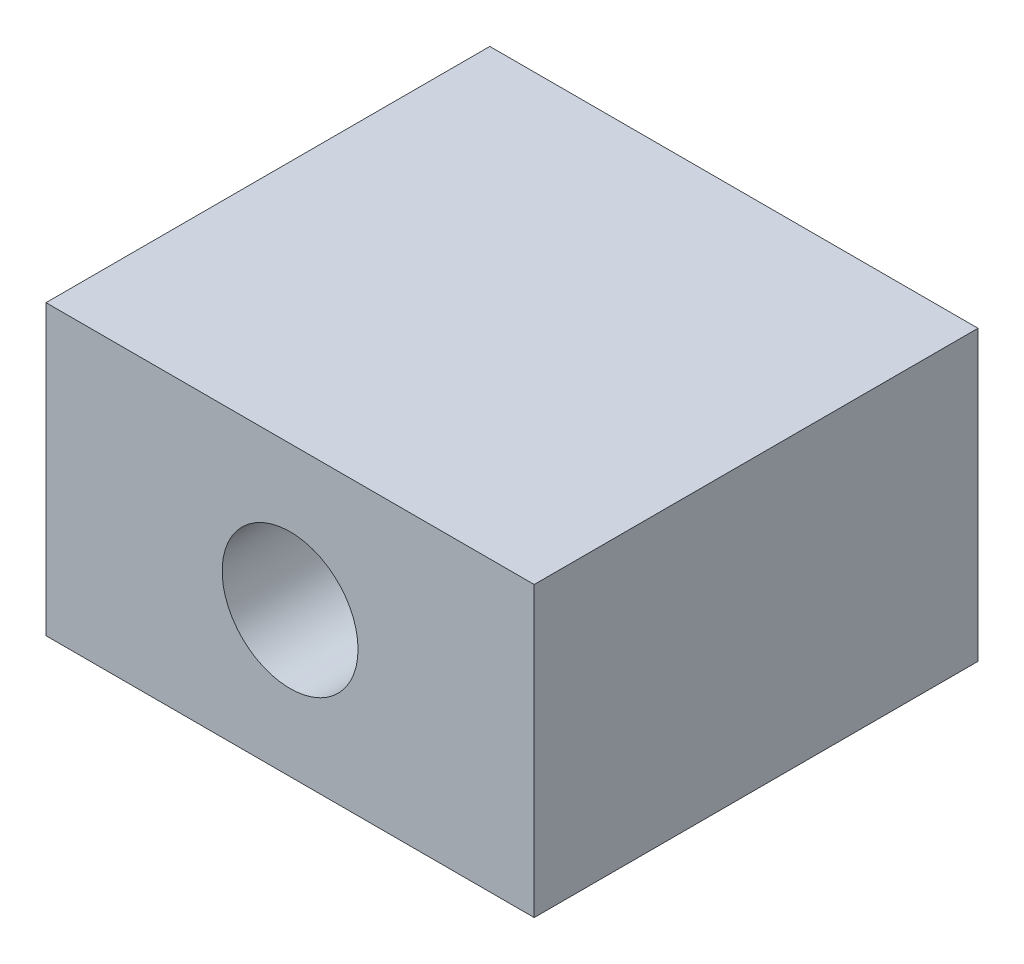
ISO-10303-21;
HEADER;
FILE_DESCRIPTION(('STEP AP214'),'2;1');
FILE_NAME('part.step','',(''),(''),'','','');
FILE_SCHEMA(('AUTOMOTIVE_DESIGN { 1 0 10303 214 1 1 1 1 }'));
ENDSEC;
DATA;
#1=APPLICATION_CONTEXT('core data for automotive mechanical design processes');
#2=APPLICATION_PROTOCOL_DEFINITION('international standard','automotive_design',2000,#1);
#3=PRODUCT_CONTEXT('',#1,'mechanical');
#4=PRODUCT('Part','Part','',(#3));
#5=PRODUCT_RELATED_PRODUCT_CATEGORY('part','',(#4));
#6=PRODUCT_DEFINITION_FORMATION('','',#4);
#7=PRODUCT_DEFINITION_CONTEXT('part definition',#1,'design');
#8=PRODUCT_DEFINITION('design','',#6,#7);
#9=PRODUCT_DEFINITION_SHAPE('','',#8);
#10=(LENGTH_UNIT() NAMED_UNIT(*) SI_UNIT(.MILLI.,.METRE.));
#11=(NAMED_UNIT(*) PLANE_ANGLE_UNIT() SI_UNIT($,.RADIAN.));
#12=(NAMED_UNIT(*) SI_UNIT($,.STERADIAN.) SOLID_ANGLE_UNIT());
#13=UNCERTAINTY_MEASURE_WITH_UNIT(LENGTH_MEASURE(1.E-05),#10,'distance_accuracy_value','');
#14=(GEOMETRIC_REPRESENTATION_CONTEXT(3) GLOBAL_UNCERTAINTY_ASSIGNED_CONTEXT((#13)) GLOBAL_UNIT_ASSIGNED_CONTEXT((#10,
#11,#12)) REPRESENTATION_CONTEXT('',''));
#15=CARTESIAN_POINT('',(0.,0.,0.));
#16=DIRECTION('',(0.,0.,1.));
#17=DIRECTION('',(1.,0.,0.));
#18=AXIS2_PLACEMENT_3D('',#15,#16,#17);
#19=CARTESIAN_POINT('',(139.7,-82.55,254.));
#20=DIRECTION('',(-1.,0.,0.));
#21=DIRECTION('',(0.,0.,1.));
#22=AXIS2_PLACEMENT_3D('',#19,#20,#21);
#23=PLANE('',#22);
#24=DIRECTION('',(0.,1.,0.));
#25=VECTOR('',#24,1.);
#26=CARTESIAN_POINT('',(139.7,-82.55,0.));
#27=LINE('',#26,#25);
#28=CARTESIAN_POINT('',(139.7,-82.55,0.));
#29=VERTEX_POINT('',#28);
#30=CARTESIAN_POINT('',(139.7,82.55,0.));
#31=VERTEX_POINT('',#30);
#32=EDGE_CURVE('E106',#29,#31,#27,.T.);
#33=ORIENTED_EDGE('',*,*,#32,.T.);
#34=DIRECTION('',(0.,0.,-1.));
#35=VECTOR('',#34,1.);
#36=CARTESIAN_POINT('',(139.7,82.55,254.));
#37=LINE('',#36,#35);
#38=CARTESIAN_POINT('',(139.7,82.55,254.));
#39=VERTEX_POINT('',#38);
#40=EDGE_CURVE('E11',#39,#31,#37,.T.);
#41=ORIENTED_EDGE('',*,*,#40,.F.);
#42=DIRECTION('',(0.,1.,0.));
#43=VECTOR('',#42,1.);
#44=CARTESIAN_POINT('',(139.7,-82.55,254.));
#45=LINE('',#44,#43);
#46=CARTESIAN_POINT('',(139.7,-82.55,254.));
#47=VERTEX_POINT('',#46);
#48=EDGE_CURVE('E94',#47,#39,#45,.T.);
#49=ORIENTED_EDGE('',*,*,#48,.F.);
#50=DIRECTION('',(0.,0.,-1.));
#51=VECTOR('',#50,1.);
#52=CARTESIAN_POINT('',(139.7,-82.55,254.));
#53=LINE('',#52,#51);
#54=EDGE_CURVE('E102',#47,#29,#53,.T.);
#55=ORIENTED_EDGE('',*,*,#54,.T.);
#56=EDGE_LOOP('',(#33,#41,#49,#55));
#57=FACE_BOUND('',#56,.T.);
#58=ADVANCED_FACE('F43',(#57),#23,.F.);
#59=CARTESIAN_POINT('',(-139.7,82.55,254.));
#60=DIRECTION('',(0.,-1.,0.));
#61=DIRECTION('',(0.,0.,-1.));
#62=AXIS2_PLACEMENT_3D('',#59,#60,#61);
#63=PLANE('',#62);
#64=DIRECTION('',(-1.,0.,0.));
#65=VECTOR('',#64,1.);
#66=CARTESIAN_POINT('',(-139.7,82.55,0.));
#67=LINE('',#66,#65);
#68=CARTESIAN_POINT('',(-139.7,82.55,0.));
#69=VERTEX_POINT('',#68);
#70=EDGE_CURVE('E98',#31,#69,#67,.T.);
#71=ORIENTED_EDGE('',*,*,#70,.T.);
#72=DIRECTION('',(0.,0.,-1.));
#73=VECTOR('',#72,1.);
#74=CARTESIAN_POINT('',(-139.7,82.55,254.));
#75=LINE('',#74,#73);
#76=CARTESIAN_POINT('',(-139.7,82.55,254.));
#77=VERTEX_POINT('',#76);
#78=EDGE_CURVE('E51',#77,#69,#75,.T.);
#79=ORIENTED_EDGE('',*,*,#78,.F.);
#80=DIRECTION('',(-1.,0.,0.));
#81=VECTOR('',#80,1.);
#82=CARTESIAN_POINT('',(-139.7,82.55,254.));
#83=LINE('',#82,#81);
#84=EDGE_CURVE('E89',#39,#77,#83,.T.);
#85=ORIENTED_EDGE('',*,*,#84,.F.);
#86=ORIENTED_EDGE('',*,*,#40,.T.);
#87=EDGE_LOOP('',(#71,#79,#85,#86));
#88=FACE_BOUND('',#87,.T.);
#89=ADVANCED_FACE('F97',(#88),#63,.F.);
#90=CARTESIAN_POINT('',(-139.7,-82.55,254.));
#91=DIRECTION('',(1.,0.,0.));
#92=DIRECTION('',(0.,0.,-1.));
#93=AXIS2_PLACEMENT_3D('',#90,#91,#92);
#94=PLANE('',#93);
#95=DIRECTION('',(0.,-1.,0.));
#96=VECTOR('',#95,1.);
#97=CARTESIAN_POINT('',(-139.7,-82.55,0.));
#98=LINE('',#97,#96);
#99=CARTESIAN_POINT('',(-139.7,-82.55,0.));
#100=VERTEX_POINT('',#99);
#101=EDGE_CURVE('E76',#69,#100,#98,.T.);
#102=ORIENTED_EDGE('',*,*,#101,.T.);
#103=DIRECTION('',(0.,0.,-1.));
#104=VECTOR('',#103,1.);
#105=CARTESIAN_POINT('',(-139.7,-82.55,254.));
#106=LINE('',#105,#104);
#107=CARTESIAN_POINT('',(-139.7,-82.55,254.));
#108=VERTEX_POINT('',#107);
#109=EDGE_CURVE('E99',#108,#100,#106,.T.);
#110=ORIENTED_EDGE('',*,*,#109,.F.);
#111=DIRECTION('',(0.,-1.,0.));
#112=VECTOR('',#111,1.);
#113=CARTESIAN_POINT('',(-139.7,-82.55,254.));
#114=LINE('',#113,#112);
#115=EDGE_CURVE('E92',#77,#108,#114,.T.);
#116=ORIENTED_EDGE('',*,*,#115,.F.);
#117=ORIENTED_EDGE('',*,*,#78,.T.);
#118=EDGE_LOOP('',(#102,#110,#116,#117));
#119=FACE_BOUND('',#118,.T.);
#120=ADVANCED_FACE('F100',(#119),#94,.F.);
#121=CARTESIAN_POINT('',(-139.7,-82.55,254.));
#122=DIRECTION('',(0.,1.,0.));
#123=DIRECTION('',(0.,0.,1.));
#124=AXIS2_PLACEMENT_3D('',#121,#122,#123);
#125=PLANE('',#124);
#126=DIRECTION('',(1.,0.,0.));
#127=VECTOR('',#126,1.);
#128=CARTESIAN_POINT('',(-139.7,-82.55,0.));
#129=LINE('',#128,#127);
#130=EDGE_CURVE('E82',#100,#29,#129,.T.);
#131=ORIENTED_EDGE('',*,*,#130,.T.);
#132=ORIENTED_EDGE('',*,*,#54,.F.);
#133=DIRECTION('',(1.,0.,0.));
#134=VECTOR('',#133,1.);
#135=CARTESIAN_POINT('',(-139.7,-82.55,254.));
#136=LINE('',#135,#134);
#137=EDGE_CURVE('E59',#108,#47,#136,.T.);
#138=ORIENTED_EDGE('',*,*,#137,.F.);
#139=ORIENTED_EDGE('',*,*,#109,.T.);
#140=EDGE_LOOP('',(#131,#132,#138,#139));
#141=FACE_BOUND('',#140,.T.);
#142=ADVANCED_FACE('F114',(#141),#125,.F.);
#143=CARTESIAN_POINT('',(0.,0.,254.));
#144=DIRECTION('',(0.,0.,-1.));
#145=DIRECTION('',(-1.,0.,0.));
#146=AXIS2_PLACEMENT_3D('',#143,#144,#145);
#147=PLANE('',#146);
#148=CARTESIAN_POINT('',(0.,0.,254.));
#149=DIRECTION('',(0.,0.,1.));
#150=DIRECTION('',(1.,0.,0.));
#151=AXIS2_PLACEMENT_3D('',#148,#149,#150);
#152=CIRCLE('',#151,38.8874);
#153=CARTESIAN_POINT('',(38.8874,0.,254.));
#154=VERTEX_POINT('',#153);
#155=EDGE_CURVE('E109',#154,#154,#152,.T.);
#156=ORIENTED_EDGE('',*,*,#155,.F.);
#157=EDGE_LOOP('',(#156));
#158=FACE_BOUND('',#157,.T.);
#159=ORIENTED_EDGE('',*,*,#48,.T.);
#160=ORIENTED_EDGE('',*,*,#84,.T.);
#161=ORIENTED_EDGE('',*,*,#115,.T.);
#162=ORIENTED_EDGE('',*,*,#137,.T.);
#163=EDGE_LOOP('',(#159,#160,#161,#162));
#164=FACE_BOUND('',#163,.T.);
#165=ADVANCED_FACE('F90',(#158,#164),#147,.F.);
#166=CARTESIAN_POINT('',(0.,0.,0.));
#167=DIRECTION('',(0.,0.,-1.));
#168=DIRECTION('',(-1.,0.,0.));
#169=AXIS2_PLACEMENT_3D('',#166,#167,#168);
#170=PLANE('',#169);
#171=CARTESIAN_POINT('',(0.,0.,0.));
#172=DIRECTION('',(0.,0.,1.));
#173=DIRECTION('',(1.,0.,0.));
#174=AXIS2_PLACEMENT_3D('',#171,#172,#173);
#175=CIRCLE('',#174,38.8874);
#176=CARTESIAN_POINT('',(38.8874,0.,0.));
#177=VERTEX_POINT('',#176);
#178=EDGE_CURVE('E120',#177,#177,#175,.T.);
#179=ORIENTED_EDGE('',*,*,#178,.T.);
#180=EDGE_LOOP('',(#179));
#181=FACE_BOUND('',#180,.T.);
#182=ORIENTED_EDGE('',*,*,#32,.F.);
#183=ORIENTED_EDGE('',*,*,#130,.F.);
#184=ORIENTED_EDGE('',*,*,#101,.F.);
#185=ORIENTED_EDGE('',*,*,#70,.F.);
#186=EDGE_LOOP('',(#182,#183,#184,#185));
#187=FACE_BOUND('',#186,.T.);
#188=ADVANCED_FACE('F117',(#181,#187),#170,.T.);
#189=CARTESIAN_POINT('',(0.,0.,254.));
#190=DIRECTION('',(0.,0.,-1.));
#191=DIRECTION('',(-1.,0.,0.));
#192=AXIS2_PLACEMENT_3D('',#189,#190,#191);
#193=CYLINDRICAL_SURFACE('',#192,38.8874);
#194=ORIENTED_EDGE('',*,*,#155,.T.);
#195=EDGE_LOOP('',(#194));
#196=FACE_BOUND('',#195,.T.);
#197=ORIENTED_EDGE('',*,*,#178,.F.);
#198=EDGE_LOOP('',(#197));
#199=FACE_BOUND('',#198,.T.);
#200=ADVANCED_FACE('F126',(#196,#199),#193,.F.);
#201=CLOSED_SHELL('',(#58,#89,#120,#142,#165,#188,#200));
#202=MANIFOLD_SOLID_BREP('B2',#201);
#203=ADVANCED_BREP_SHAPE_REPRESENTATION('',(#18,#202),#14);
#204=SHAPE_DEFINITION_REPRESENTATION(#9,#203);
ENDSEC;
END-ISO-10303-21;
